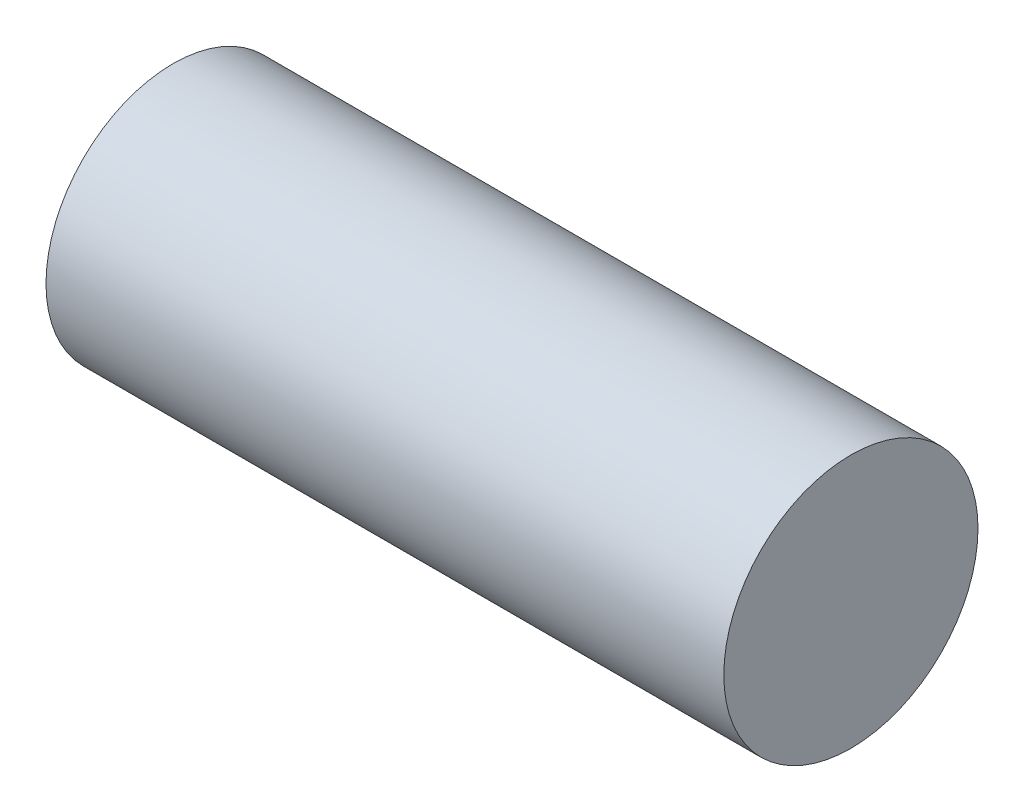
ISO-10303-21;
HEADER;
FILE_DESCRIPTION(('STEP AP214'),'2;1');
FILE_NAME('part.step','',(''),(''),'','','');
FILE_SCHEMA(('AUTOMOTIVE_DESIGN { 1 0 10303 214 1 1 1 1 }'));
ENDSEC;
DATA;
#1=APPLICATION_CONTEXT('core data for automotive mechanical design processes');
#2=APPLICATION_PROTOCOL_DEFINITION('international standard','automotive_design',2000,#1);
#3=PRODUCT_CONTEXT('',#1,'mechanical');
#4=PRODUCT('Part','Part','',(#3));
#5=PRODUCT_RELATED_PRODUCT_CATEGORY('part','',(#4));
#6=PRODUCT_DEFINITION_FORMATION('','',#4);
#7=PRODUCT_DEFINITION_CONTEXT('part definition',#1,'design');
#8=PRODUCT_DEFINITION('design','',#6,#7);
#9=PRODUCT_DEFINITION_SHAPE('','',#8);
#10=(LENGTH_UNIT() NAMED_UNIT(*) SI_UNIT(.MILLI.,.METRE.));
#11=(NAMED_UNIT(*) PLANE_ANGLE_UNIT() SI_UNIT($,.RADIAN.));
#12=(NAMED_UNIT(*) SI_UNIT($,.STERADIAN.) SOLID_ANGLE_UNIT());
#13=UNCERTAINTY_MEASURE_WITH_UNIT(LENGTH_MEASURE(1.E-05),#10,'distance_accuracy_value','');
#14=(GEOMETRIC_REPRESENTATION_CONTEXT(3) GLOBAL_UNCERTAINTY_ASSIGNED_CONTEXT((#13)) GLOBAL_UNIT_ASSIGNED_CONTEXT((#10,
#11,#12)) REPRESENTATION_CONTEXT('',''));
#15=CARTESIAN_POINT('',(0.,0.,0.));
#16=DIRECTION('',(0.,0.,1.));
#17=DIRECTION('',(1.,0.,0.));
#18=AXIS2_PLACEMENT_3D('',#15,#16,#17);
#19=CARTESIAN_POINT('',(0.,0.,0.));
#20=DIRECTION('',(1.,0.,0.));
#21=DIRECTION('',(0.,1.,0.));
#22=AXIS2_PLACEMENT_3D('',#19,#20,#21);
#23=PLANE('',#22);
#24=CARTESIAN_POINT('',(0.,0.,0.));
#25=DIRECTION('',(1.,0.,0.));
#26=DIRECTION('',(0.,1.,0.));
#27=AXIS2_PLACEMENT_3D('',#24,#25,#26);
#28=CIRCLE('',#27,60.);
#29=CARTESIAN_POINT('',(0.,60.,0.));
#30=VERTEX_POINT('',#29);
#31=EDGE_CURVE('E10',#30,#30,#28,.T.);
#32=ORIENTED_EDGE('',*,*,#31,.F.);
#33=EDGE_LOOP('',(#32));
#34=FACE_BOUND('',#33,.T.);
#35=ADVANCED_FACE('F34',(#34),#23,.F.);
#36=CARTESIAN_POINT('',(10.,0.,0.));
#37=DIRECTION('',(1.,0.,0.));
#38=DIRECTION('',(0.,1.,0.));
#39=AXIS2_PLACEMENT_3D('',#36,#37,#38);
#40=CYLINDRICAL_SURFACE('',#39,60.);
#41=CARTESIAN_POINT('',(320.,0.,0.));
#42=DIRECTION('',(1.,0.,0.));
#43=DIRECTION('',(0.,1.,0.));
#44=AXIS2_PLACEMENT_3D('',#41,#42,#43);
#45=CIRCLE('',#44,60.);
#46=CARTESIAN_POINT('',(320.,60.,0.));
#47=VERTEX_POINT('',#46);
#48=EDGE_CURVE('E42',#47,#47,#45,.T.);
#49=ORIENTED_EDGE('',*,*,#48,.F.);
#50=EDGE_LOOP('',(#49));
#51=FACE_BOUND('',#50,.T.);
#52=ORIENTED_EDGE('',*,*,#31,.T.);
#53=EDGE_LOOP('',(#52));
#54=FACE_BOUND('',#53,.T.);
#55=ADVANCED_FACE('F112',(#51,#54),#40,.T.);
#56=CARTESIAN_POINT('',(320.,0.,0.));
#57=DIRECTION('',(1.,0.,0.));
#58=DIRECTION('',(0.,1.,0.));
#59=AXIS2_PLACEMENT_3D('',#56,#57,#58);
#60=PLANE('',#59);
#61=ORIENTED_EDGE('',*,*,#48,.T.);
#62=EDGE_LOOP('',(#61));
#63=FACE_BOUND('',#62,.T.);
#64=ADVANCED_FACE('F110',(#63),#60,.T.);
#65=CLOSED_SHELL('',(#35,#55,#64));
#66=CARTESIAN_POINT('',(9.99999999999999,0.,0.));
#67=DIRECTION('',(-1.,0.,0.));
#68=DIRECTION('',(0.,-1.,0.));
#69=AXIS2_PLACEMENT_3D('',#66,#67,#68);
#70=PLANE('',#69);
#71=CARTESIAN_POINT('',(9.99999999999999,0.,0.));
#72=DIRECTION('',(1.,0.,0.));
#73=DIRECTION('',(0.,1.,0.));
#74=AXIS2_PLACEMENT_3D('',#71,#72,#73);
#75=CIRCLE('',#74,50.0000000000002);
#76=CARTESIAN_POINT('',(9.99999999999999,50.0000000000002,0.));
#77=VERTEX_POINT('',#76);
#78=EDGE_CURVE('E64',#77,#77,#75,.T.);
#79=ORIENTED_EDGE('',*,*,#78,.T.);
#80=EDGE_LOOP('',(#79));
#81=FACE_BOUND('',#80,.T.);
#82=ADVANCED_FACE('F36',(#81),#70,.F.);
#83=CARTESIAN_POINT('',(310.,3.44169137633798E-13,0.));
#84=DIRECTION('',(-1.,0.,0.));
#85=DIRECTION('',(0.,-1.,0.));
#86=AXIS2_PLACEMENT_3D('',#83,#84,#85);
#87=PLANE('',#86);
#88=CARTESIAN_POINT('',(310.,0.,0.));
#89=DIRECTION('',(1.,0.,0.));
#90=DIRECTION('',(0.,1.,0.));
#91=AXIS2_PLACEMENT_3D('',#88,#89,#90);
#92=CIRCLE('',#91,50.0000000000001);
#93=CARTESIAN_POINT('',(310.,50.0000000000001,0.));
#94=VERTEX_POINT('',#93);
#95=EDGE_CURVE('E46',#94,#94,#92,.T.);
#96=ORIENTED_EDGE('',*,*,#95,.F.);
#97=EDGE_LOOP('',(#96));
#98=FACE_BOUND('',#97,.T.);
#99=ADVANCED_FACE('F96',(#98),#87,.T.);
#100=CARTESIAN_POINT('',(10.,0.,0.));
#101=DIRECTION('',(1.,0.,0.));
#102=DIRECTION('',(0.,1.,0.));
#103=AXIS2_PLACEMENT_3D('',#100,#101,#102);
#104=CYLINDRICAL_SURFACE('',#103,50.0000000000001);
#105=ORIENTED_EDGE('',*,*,#95,.T.);
#106=EDGE_LOOP('',(#105));
#107=FACE_BOUND('',#106,.T.);
#108=CARTESIAN_POINT('',(210.,0.,0.));
#109=DIRECTION('',(1.,0.,0.));
#110=DIRECTION('',(0.,1.,0.));
#111=AXIS2_PLACEMENT_3D('',#108,#109,#110);
#112=CIRCLE('',#111,50.0000000000001);
#113=CARTESIAN_POINT('',(210.,50.0000000000001,0.));
#114=VERTEX_POINT('',#113);
#115=EDGE_CURVE('E50',#114,#114,#112,.T.);
#116=ORIENTED_EDGE('',*,*,#115,.F.);
#117=EDGE_LOOP('',(#116));
#118=FACE_BOUND('',#117,.T.);
#119=ADVANCED_FACE('F90',(#107,#118),#104,.F.);
#120=CARTESIAN_POINT('',(170.,0.,0.));
#121=DIRECTION('',(1.,0.,0.));
#122=DIRECTION('',(0.,1.,0.));
#123=AXIS2_PLACEMENT_3D('',#120,#121,#122);
#124=CONICAL_SURFACE('',#123,10.,0.78539816339745);
#125=CARTESIAN_POINT('',(170.,0.,0.));
#126=DIRECTION('',(1.,0.,0.));
#127=DIRECTION('',(0.,1.,0.));
#128=AXIS2_PLACEMENT_3D('',#125,#126,#127);
#129=CIRCLE('',#128,10.);
#130=CARTESIAN_POINT('',(170.,10.,0.));
#131=VERTEX_POINT('',#130);
#132=EDGE_CURVE('E55',#131,#131,#129,.T.);
#133=CARTESIAN_POINT('',(210.,50.0000000000001,0.));
#134=CARTESIAN_POINT('',(209.583333333333,49.5833333333335,0.));
#135=CARTESIAN_POINT('',(209.166666666667,49.1666666666668,0.));
#136=CARTESIAN_POINT('',(208.333333333333,48.3333333333335,0.));
#137=CARTESIAN_POINT('',(207.916666666667,47.9166666666668,0.));
#138=CARTESIAN_POINT('',(207.083333333333,47.0833333333335,0.));
#139=CARTESIAN_POINT('',(206.666666666667,46.6666666666668,0.));
#140=CARTESIAN_POINT('',(205.833333333333,45.8333333333335,0.));
#141=CARTESIAN_POINT('',(205.416666666667,45.4166666666668,0.));
#142=CARTESIAN_POINT('',(204.583333333333,44.5833333333335,0.));
#143=CARTESIAN_POINT('',(204.166666666667,44.1666666666668,0.));
#144=CARTESIAN_POINT('',(203.333333333333,43.3333333333335,0.));
#145=CARTESIAN_POINT('',(202.916666666667,42.9166666666668,0.));
#146=CARTESIAN_POINT('',(202.083333333333,42.0833333333335,0.));
#147=CARTESIAN_POINT('',(201.666666666667,41.6666666666668,0.));
#148=CARTESIAN_POINT('',(200.833333333333,40.8333333333334,0.));
#149=CARTESIAN_POINT('',(200.416666666667,40.4166666666668,0.));
#150=CARTESIAN_POINT('',(199.583333333333,39.5833333333334,0.));
#151=CARTESIAN_POINT('',(199.166666666667,39.1666666666668,0.));
#152=CARTESIAN_POINT('',(198.333333333333,38.3333333333334,0.));
#153=CARTESIAN_POINT('',(197.916666666667,37.9166666666668,0.));
#154=CARTESIAN_POINT('',(197.083333333333,37.0833333333334,0.));
#155=CARTESIAN_POINT('',(196.666666666667,36.6666666666668,0.));
#156=CARTESIAN_POINT('',(195.833333333333,35.8333333333334,0.));
#157=CARTESIAN_POINT('',(195.416666666667,35.4166666666668,0.));
#158=CARTESIAN_POINT('',(194.583333333333,34.5833333333334,0.));
#159=CARTESIAN_POINT('',(194.166666666667,34.1666666666668,0.));
#160=CARTESIAN_POINT('',(193.333333333333,33.3333333333334,0.));
#161=CARTESIAN_POINT('',(192.916666666667,32.9166666666668,0.));
#162=CARTESIAN_POINT('',(192.083333333333,32.0833333333334,0.));
#163=CARTESIAN_POINT('',(191.666666666667,31.6666666666668,0.));
#164=CARTESIAN_POINT('',(190.833333333333,30.8333333333334,0.));
#165=CARTESIAN_POINT('',(190.416666666667,30.4166666666667,0.));
#166=CARTESIAN_POINT('',(189.583333333333,29.5833333333334,0.));
#167=CARTESIAN_POINT('',(189.166666666667,29.1666666666667,0.));
#168=CARTESIAN_POINT('',(188.333333333333,28.3333333333334,0.));
#169=CARTESIAN_POINT('',(187.916666666667,27.9166666666667,0.));
#170=CARTESIAN_POINT('',(187.083333333333,27.0833333333334,0.));
#171=CARTESIAN_POINT('',(186.666666666667,26.6666666666667,0.));
#172=CARTESIAN_POINT('',(185.833333333333,25.8333333333334,0.));
#173=CARTESIAN_POINT('',(185.416666666667,25.4166666666667,0.));
#174=CARTESIAN_POINT('',(184.583333333333,24.5833333333334,0.));
#175=CARTESIAN_POINT('',(184.166666666667,24.1666666666667,0.));
#176=CARTESIAN_POINT('',(183.333333333333,23.3333333333334,0.));
#177=CARTESIAN_POINT('',(182.916666666667,22.9166666666667,0.));
#178=CARTESIAN_POINT('',(182.083333333333,22.0833333333334,0.));
#179=CARTESIAN_POINT('',(181.666666666667,21.6666666666667,0.));
#180=CARTESIAN_POINT('',(180.833333333333,20.8333333333334,0.));
#181=CARTESIAN_POINT('',(180.416666666667,20.4166666666667,0.));
#182=CARTESIAN_POINT('',(179.583333333333,19.5833333333334,0.));
#183=CARTESIAN_POINT('',(179.166666666667,19.1666666666667,0.));
#184=CARTESIAN_POINT('',(178.333333333333,18.3333333333334,0.));
#185=CARTESIAN_POINT('',(177.916666666667,17.9166666666667,0.));
#186=CARTESIAN_POINT('',(177.083333333333,17.0833333333334,0.));
#187=CARTESIAN_POINT('',(176.666666666667,16.6666666666667,0.));
#188=CARTESIAN_POINT('',(175.833333333333,15.8333333333334,0.));
#189=CARTESIAN_POINT('',(175.416666666667,15.4166666666667,0.));
#190=CARTESIAN_POINT('',(174.583333333333,14.5833333333334,0.));
#191=CARTESIAN_POINT('',(174.166666666667,14.1666666666667,0.));
#192=CARTESIAN_POINT('',(173.333333333333,13.3333333333334,0.));
#193=CARTESIAN_POINT('',(172.916666666667,12.9166666666667,0.));
#194=CARTESIAN_POINT('',(172.083333333333,12.0833333333333,0.));
#195=CARTESIAN_POINT('',(171.666666666667,11.6666666666667,0.));
#196=CARTESIAN_POINT('',(170.833333333333,10.8333333333334,0.));
#197=CARTESIAN_POINT('',(170.416666666667,10.4166666666667,0.));
#198=CARTESIAN_POINT('',(170.,10.,0.));
#199=B_SPLINE_CURVE_WITH_KNOTS('',3,(#133,#134,#135,#136,#137,#138,#139,#140,#141,#142,#143,
#144,#145,#146,#147,#148,#149,#150,#151,#152,#153,#154,#155,#156,#157,#158,#159,#160,#161,#162,
#163,#164,#165,#166,#167,#168,#169,#170,#171,#172,#173,#174,#175,#176,#177,#178,#179,#180,#181,
#182,#183,#184,#185,#186,#187,#188,#189,#190,#191,#192,#193,#194,#195,#196,#197,#198),
.UNSPECIFIED.,.F.,.F.,(4,2,2,2,2,2,2,2,2,2,2,2,2,2,2,2,2,2,2,2,2,2,2,2,2,2,2,2,2,2,2,2,4),(0.,
1.76776695296636,3.53553390593275,5.3033008588991,7.07106781186549,8.83883476483184,
10.6066017177982,12.3743686707646,14.142135623731,15.9099025766973,17.6776695296637,
19.4454364826301,21.2132034355965,22.9809703885628,24.7487373415292,26.5165042944956,
28.2842712474619,30.0520382004283,31.8198051533947,33.5875721063611,35.3553390593274,
37.1231060122938,38.8908729652602,40.6586399182265,42.4264068711929,44.1941738241593,
45.9619407771256,47.729707730092,49.4974746830584,51.2652416360248,53.0330085889911,
54.8007755419575,56.5685424949239),.UNSPECIFIED.);
#200=EDGE_CURVE('BSEAM85',#114,#131,#199,.T.);
#201=ORIENTED_EDGE('',*,*,#115,.T.);
#202=ORIENTED_EDGE('',*,*,#132,.F.);
#203=ORIENTED_EDGE('',*,*,#200,.T.);
#204=ORIENTED_EDGE('',*,*,#200,.F.);
#205=EDGE_LOOP('',(#201,#203,#202,#204));
#206=FACE_BOUND('',#205,.T.);
#207=ADVANCED_FACE('F85',(#206),#124,.F.);
#208=CARTESIAN_POINT('',(10.,0.,0.));
#209=DIRECTION('',(1.,0.,0.));
#210=DIRECTION('',(0.,1.,0.));
#211=AXIS2_PLACEMENT_3D('',#208,#209,#210);
#212=CYLINDRICAL_SURFACE('',#211,10.);
#213=CARTESIAN_POINT('',(150.,0.,0.));
#214=DIRECTION('',(1.,0.,0.));
#215=DIRECTION('',(0.,1.,0.));
#216=AXIS2_PLACEMENT_3D('',#213,#214,#215);
#217=CIRCLE('',#216,9.99999999999999);
#218=CARTESIAN_POINT('',(150.,-10.,0.));
#219=VERTEX_POINT('',#218);
#220=EDGE_CURVE('E58',#219,#219,#217,.T.);
#221=ORIENTED_EDGE('',*,*,#220,.F.);
#222=EDGE_LOOP('',(#221));
#223=FACE_BOUND('',#222,.T.);
#224=ORIENTED_EDGE('',*,*,#132,.T.);
#225=EDGE_LOOP('',(#224));
#226=FACE_BOUND('',#225,.T.);
#227=ADVANCED_FACE('F79',(#223,#226),#212,.F.);
#228=CARTESIAN_POINT('',(150.,0.,0.));
#229=DIRECTION('',(-1.,0.,0.));
#230=DIRECTION('',(0.,-1.,0.));
#231=AXIS2_PLACEMENT_3D('',#228,#229,#230);
#232=CONICAL_SURFACE('',#231,9.99999999999999,0.78539816339745);
#233=CARTESIAN_POINT('',(110.,0.,0.));
#234=DIRECTION('',(1.,0.,0.));
#235=DIRECTION('',(0.,1.,0.));
#236=AXIS2_PLACEMENT_3D('',#233,#234,#235);
#237=CIRCLE('',#236,50.0000000000001);
#238=CARTESIAN_POINT('',(110.,-50.0000000000001,0.));
#239=VERTEX_POINT('',#238);
#240=EDGE_CURVE('E61',#239,#239,#237,.T.);
#241=CARTESIAN_POINT('',(110.,-50.0000000000001,0.));
#242=CARTESIAN_POINT('',(110.416666666667,-49.5833333333335,0.));
#243=CARTESIAN_POINT('',(110.833333333333,-49.1666666666668,0.));
#244=CARTESIAN_POINT('',(111.666666666667,-48.3333333333335,0.));
#245=CARTESIAN_POINT('',(112.083333333333,-47.9166666666668,0.));
#246=CARTESIAN_POINT('',(112.916666666667,-47.0833333333335,0.));
#247=CARTESIAN_POINT('',(113.333333333333,-46.6666666666668,0.));
#248=CARTESIAN_POINT('',(114.166666666667,-45.8333333333335,0.));
#249=CARTESIAN_POINT('',(114.583333333333,-45.4166666666668,0.));
#250=CARTESIAN_POINT('',(115.416666666667,-44.5833333333335,0.));
#251=CARTESIAN_POINT('',(115.833333333333,-44.1666666666668,0.));
#252=CARTESIAN_POINT('',(116.666666666667,-43.3333333333334,0.));
#253=CARTESIAN_POINT('',(117.083333333333,-42.9166666666668,0.));
#254=CARTESIAN_POINT('',(117.916666666667,-42.0833333333334,0.));
#255=CARTESIAN_POINT('',(118.333333333333,-41.6666666666668,0.));
#256=CARTESIAN_POINT('',(119.166666666667,-40.8333333333334,0.));
#257=CARTESIAN_POINT('',(119.583333333333,-40.4166666666668,0.));
#258=CARTESIAN_POINT('',(120.416666666667,-39.5833333333334,0.));
#259=CARTESIAN_POINT('',(120.833333333333,-39.1666666666668,0.));
#260=CARTESIAN_POINT('',(121.666666666667,-38.3333333333334,0.));
#261=CARTESIAN_POINT('',(122.083333333333,-37.9166666666668,0.));
#262=CARTESIAN_POINT('',(122.916666666667,-37.0833333333334,0.));
#263=CARTESIAN_POINT('',(123.333333333333,-36.6666666666668,0.));
#264=CARTESIAN_POINT('',(124.166666666667,-35.8333333333334,0.));
#265=CARTESIAN_POINT('',(124.583333333333,-35.4166666666668,0.));
#266=CARTESIAN_POINT('',(125.416666666667,-34.5833333333334,0.));
#267=CARTESIAN_POINT('',(125.833333333333,-34.1666666666668,0.));
#268=CARTESIAN_POINT('',(126.666666666667,-33.3333333333334,0.));
#269=CARTESIAN_POINT('',(127.083333333333,-32.9166666666668,0.));
#270=CARTESIAN_POINT('',(127.916666666667,-32.0833333333334,0.));
#271=CARTESIAN_POINT('',(128.333333333333,-31.6666666666667,0.));
#272=CARTESIAN_POINT('',(129.166666666667,-30.8333333333334,0.));
#273=CARTESIAN_POINT('',(129.583333333333,-30.4166666666667,0.));
#274=CARTESIAN_POINT('',(130.416666666667,-29.5833333333334,0.));
#275=CARTESIAN_POINT('',(130.833333333333,-29.1666666666667,0.));
#276=CARTESIAN_POINT('',(131.666666666667,-28.3333333333334,0.));
#277=CARTESIAN_POINT('',(132.083333333333,-27.9166666666667,0.));
#278=CARTESIAN_POINT('',(132.916666666667,-27.0833333333334,0.));
#279=CARTESIAN_POINT('',(133.333333333333,-26.6666666666667,0.));
#280=CARTESIAN_POINT('',(134.166666666667,-25.8333333333334,0.));
#281=CARTESIAN_POINT('',(134.583333333333,-25.4166666666667,0.));
#282=CARTESIAN_POINT('',(135.416666666667,-24.5833333333334,0.));
#283=CARTESIAN_POINT('',(135.833333333333,-24.1666666666667,0.));
#284=CARTESIAN_POINT('',(136.666666666667,-23.3333333333334,0.));
#285=CARTESIAN_POINT('',(137.083333333333,-22.9166666666667,0.));
#286=CARTESIAN_POINT('',(137.916666666667,-22.0833333333334,0.));
#287=CARTESIAN_POINT('',(138.333333333333,-21.6666666666667,0.));
#288=CARTESIAN_POINT('',(139.166666666667,-20.8333333333334,0.));
#289=CARTESIAN_POINT('',(139.583333333333,-20.4166666666667,0.));
#290=CARTESIAN_POINT('',(140.416666666667,-19.5833333333334,0.));
#291=CARTESIAN_POINT('',(140.833333333333,-19.1666666666667,0.));
#292=CARTESIAN_POINT('',(141.666666666667,-18.3333333333334,0.));
#293=CARTESIAN_POINT('',(142.083333333333,-17.9166666666667,0.));
#294=CARTESIAN_POINT('',(142.916666666667,-17.0833333333334,0.));
#295=CARTESIAN_POINT('',(143.333333333333,-16.6666666666667,0.));
#296=CARTESIAN_POINT('',(144.166666666667,-15.8333333333334,0.));
#297=CARTESIAN_POINT('',(144.583333333333,-15.4166666666667,0.));
#298=CARTESIAN_POINT('',(145.416666666667,-14.5833333333334,0.));
#299=CARTESIAN_POINT('',(145.833333333333,-14.1666666666667,0.));
#300=CARTESIAN_POINT('',(146.666666666667,-13.3333333333334,0.));
#301=CARTESIAN_POINT('',(147.083333333333,-12.9166666666667,0.));
#302=CARTESIAN_POINT('',(147.916666666667,-12.0833333333333,0.));
#303=CARTESIAN_POINT('',(148.333333333333,-11.6666666666667,0.));
#304=CARTESIAN_POINT('',(149.166666666667,-10.8333333333334,0.));
#305=CARTESIAN_POINT('',(149.583333333333,-10.4166666666667,0.));
#306=CARTESIAN_POINT('',(150.,-10.,0.));
#307=B_SPLINE_CURVE_WITH_KNOTS('',3,(#241,#242,#243,#244,#245,#246,#247,#248,#249,#250,#251,
#252,#253,#254,#255,#256,#257,#258,#259,#260,#261,#262,#263,#264,#265,#266,#267,#268,#269,#270,
#271,#272,#273,#274,#275,#276,#277,#278,#279,#280,#281,#282,#283,#284,#285,#286,#287,#288,#289,
#290,#291,#292,#293,#294,#295,#296,#297,#298,#299,#300,#301,#302,#303,#304,#305,#306),
.UNSPECIFIED.,.F.,.F.,(4,2,2,2,2,2,2,2,2,2,2,2,2,2,2,2,2,2,2,2,2,2,2,2,2,2,2,2,2,2,2,2,4),(0.,
1.76776695296637,3.53553390593275,5.3033008588991,7.07106781186548,8.83883476483185,
10.6066017177982,12.3743686707646,14.142135623731,15.9099025766973,17.6776695296637,
19.4454364826301,21.2132034355965,22.9809703885628,24.7487373415292,26.5165042944956,
28.2842712474619,30.0520382004283,31.8198051533947,33.587572106361,35.3553390593274,
37.1231060122938,38.8908729652602,40.6586399182265,42.4264068711929,44.1941738241593,
45.9619407771256,47.729707730092,49.4974746830584,51.2652416360247,53.0330085889911,
54.8007755419575,56.5685424949238),.UNSPECIFIED.);
#308=EDGE_CURVE('BSEAM72',#239,#219,#307,.T.);
#309=ORIENTED_EDGE('',*,*,#240,.F.);
#310=ORIENTED_EDGE('',*,*,#220,.T.);
#311=ORIENTED_EDGE('',*,*,#308,.T.);
#312=ORIENTED_EDGE('',*,*,#308,.F.);
#313=EDGE_LOOP('',(#309,#311,#310,#312));
#314=FACE_BOUND('',#313,.T.);
#315=ADVANCED_FACE('F72',(#314),#232,.F.);
#316=CARTESIAN_POINT('',(10.,0.,0.));
#317=DIRECTION('',(1.,0.,0.));
#318=DIRECTION('',(0.,1.,0.));
#319=AXIS2_PLACEMENT_3D('',#316,#317,#318);
#320=CYLINDRICAL_SURFACE('',#319,50.0000000000001);
#321=ORIENTED_EDGE('',*,*,#78,.F.);
#322=EDGE_LOOP('',(#321));
#323=FACE_BOUND('',#322,.T.);
#324=ORIENTED_EDGE('',*,*,#240,.T.);
#325=EDGE_LOOP('',(#324));
#326=FACE_BOUND('',#325,.T.);
#327=ADVANCED_FACE('F69',(#323,#326),#320,.F.);
#328=CLOSED_SHELL('',(#82,#99,#119,#207,#227,#315,#327));
#329=ORIENTED_CLOSED_SHELL('',*,#328,.T.);
#330=BREP_WITH_VOIDS('B2',#65,(#329));
#331=ADVANCED_BREP_SHAPE_REPRESENTATION('',(#18,#330),#14);
#332=SHAPE_DEFINITION_REPRESENTATION(#9,#331);
ENDSEC;
END-ISO-10303-21;
